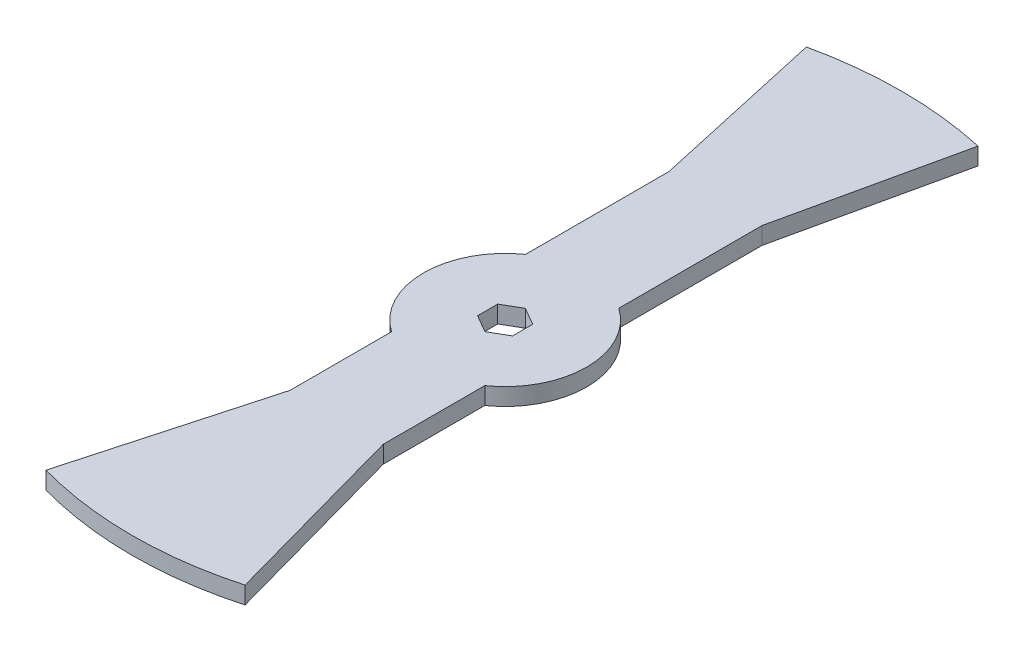
ISO-10303-21;
HEADER;
FILE_DESCRIPTION(('STEP AP214'),'2;1');
FILE_NAME('part.step','',(''),(''),'','','');
FILE_SCHEMA(('AUTOMOTIVE_DESIGN { 1 0 10303 214 1 1 1 1 }'));
ENDSEC;
DATA;
#1=APPLICATION_CONTEXT('core data for automotive mechanical design processes');
#2=APPLICATION_PROTOCOL_DEFINITION('international standard','automotive_design',2000,#1);
#3=PRODUCT_CONTEXT('',#1,'mechanical');
#4=PRODUCT('Part','Part','',(#3));
#5=PRODUCT_RELATED_PRODUCT_CATEGORY('part','',(#4));
#6=PRODUCT_DEFINITION_FORMATION('','',#4);
#7=PRODUCT_DEFINITION_CONTEXT('part definition',#1,'design');
#8=PRODUCT_DEFINITION('design','',#6,#7);
#9=PRODUCT_DEFINITION_SHAPE('','',#8);
#10=(LENGTH_UNIT() NAMED_UNIT(*) SI_UNIT(.MILLI.,.METRE.));
#11=(NAMED_UNIT(*) PLANE_ANGLE_UNIT() SI_UNIT($,.RADIAN.));
#12=(NAMED_UNIT(*) SI_UNIT($,.STERADIAN.) SOLID_ANGLE_UNIT());
#13=UNCERTAINTY_MEASURE_WITH_UNIT(LENGTH_MEASURE(1.E-05),#10,'distance_accuracy_value','');
#14=(GEOMETRIC_REPRESENTATION_CONTEXT(3) GLOBAL_UNCERTAINTY_ASSIGNED_CONTEXT((#13)) GLOBAL_UNIT_ASSIGNED_CONTEXT((#10,
#11,#12)) REPRESENTATION_CONTEXT('',''));
#15=CARTESIAN_POINT('',(0.,0.,0.));
#16=DIRECTION('',(0.,0.,1.));
#17=DIRECTION('',(1.,0.,0.));
#18=AXIS2_PLACEMENT_3D('',#15,#16,#17);
#19=CARTESIAN_POINT('',(-12.7,2.3495,-57.2859979965079));
#20=DIRECTION('',(1.,0.,0.));
#21=DIRECTION('',(0.,0.,-1.));
#22=AXIS2_PLACEMENT_3D('',#19,#20,#21);
#23=PLANE('',#22);
#24=DIRECTION('',(0.,0.,1.));
#25=VECTOR('',#24,1.);
#26=CARTESIAN_POINT('',(-12.7,2.3495,-57.2859979965079));
#27=LINE('',#26,#25);
#28=CARTESIAN_POINT('',(-12.7,2.3495,18.2389864027582));
#29=VERTEX_POINT('',#28);
#30=CARTESIAN_POINT('',(-12.7,2.3495,45.8886315989288));
#31=VERTEX_POINT('',#30);
#32=EDGE_CURVE('E180',#29,#31,#27,.T.);
#33=ORIENTED_EDGE('',*,*,#32,.F.);
#34=DIRECTION('',(0.,-1.,0.));
#35=VECTOR('',#34,1.);
#36=CARTESIAN_POINT('',(-12.7,65.2112928474841,18.2389864027582));
#37=LINE('',#36,#35);
#38=CARTESIAN_POINT('',(-12.7,-2.3495,18.2389864027582));
#39=VERTEX_POINT('',#38);
#40=EDGE_CURVE('E160',#29,#39,#37,.T.);
#41=ORIENTED_EDGE('',*,*,#40,.T.);
#42=DIRECTION('',(0.,0.,1.));
#43=VECTOR('',#42,1.);
#44=CARTESIAN_POINT('',(-12.7,-2.3495,-57.2859979965079));
#45=LINE('',#44,#43);
#46=CARTESIAN_POINT('',(-12.7,-2.3495,45.8886315989288));
#47=VERTEX_POINT('',#46);
#48=EDGE_CURVE('E202',#39,#47,#45,.T.);
#49=ORIENTED_EDGE('',*,*,#48,.T.);
#50=DIRECTION('',(0.,-1.,0.));
#51=VECTOR('',#50,1.);
#52=CARTESIAN_POINT('',(-12.7,2.3495,45.8886315989288));
#53=LINE('',#52,#51);
#54=EDGE_CURVE('E231',#31,#47,#53,.T.);
#55=ORIENTED_EDGE('',*,*,#54,.F.);
#56=EDGE_LOOP('',(#33,#41,#49,#55));
#57=FACE_BOUND('',#56,.T.);
#58=ADVANCED_FACE('F33',(#57),#23,.F.);
#59=CARTESIAN_POINT('',(12.7,2.3495,-57.2859979965078));
#60=DIRECTION('',(-1.,0.,0.));
#61=DIRECTION('',(0.,0.,1.));
#62=AXIS2_PLACEMENT_3D('',#59,#60,#61);
#63=PLANE('',#62);
#64=DIRECTION('',(0.,0.,-1.));
#65=VECTOR('',#64,1.);
#66=CARTESIAN_POINT('',(12.7,2.3495,-57.2859979965078));
#67=LINE('',#66,#65);
#68=CARTESIAN_POINT('',(12.7,2.3495,-18.2389864027582));
#69=VERTEX_POINT('',#68);
#70=CARTESIAN_POINT('',(12.7,2.3495,-57.2859979965078));
#71=VERTEX_POINT('',#70);
#72=EDGE_CURVE('E190',#69,#71,#67,.T.);
#73=ORIENTED_EDGE('',*,*,#72,.F.);
#74=DIRECTION('',(0.,-1.,0.));
#75=VECTOR('',#74,1.);
#76=CARTESIAN_POINT('',(12.7,65.2112928474841,-18.2389864027582));
#77=LINE('',#76,#75);
#78=CARTESIAN_POINT('',(12.7,-2.3495,-18.2389864027582));
#79=VERTEX_POINT('',#78);
#80=EDGE_CURVE('E172',#69,#79,#77,.T.);
#81=ORIENTED_EDGE('',*,*,#80,.T.);
#82=DIRECTION('',(0.,0.,-1.));
#83=VECTOR('',#82,1.);
#84=CARTESIAN_POINT('',(12.7,-2.3495,-57.2859979965078));
#85=LINE('',#84,#83);
#86=CARTESIAN_POINT('',(12.7,-2.3495,-57.2859979965078));
#87=VERTEX_POINT('',#86);
#88=EDGE_CURVE('E210',#79,#87,#85,.T.);
#89=ORIENTED_EDGE('',*,*,#88,.T.);
#90=DIRECTION('',(0.,-1.,0.));
#91=VECTOR('',#90,1.);
#92=CARTESIAN_POINT('',(12.7,2.3495,-57.2859979965078));
#93=LINE('',#92,#91);
#94=EDGE_CURVE('E219',#71,#87,#93,.T.);
#95=ORIENTED_EDGE('',*,*,#94,.F.);
#96=EDGE_LOOP('',(#73,#81,#89,#95));
#97=FACE_BOUND('',#96,.T.);
#98=ADVANCED_FACE('F310',(#97),#63,.F.);
#99=CARTESIAN_POINT('',(0.,2.3495,0.));
#100=DIRECTION('',(0.,-1.,0.));
#101=DIRECTION('',(0.,0.,-1.));
#102=AXIS2_PLACEMENT_3D('',#99,#100,#101);
#103=CYLINDRICAL_SURFACE('',#102,107.95);
#104=CARTESIAN_POINT('',(0.,-2.3495,0.));
#105=DIRECTION('',(0.,1.,0.));
#106=DIRECTION('',(0.,0.,-1.));
#107=AXIS2_PLACEMENT_3D('',#104,#105,#106);
#108=CIRCLE('',#107,107.95);
#109=CARTESIAN_POINT('',(23.3646563246183,-2.3495,-105.391153968597));
#110=VERTEX_POINT('',#109);
#111=CARTESIAN_POINT('',(-23.3646563246183,-2.3495,-105.391153968597));
#112=VERTEX_POINT('',#111);
#113=EDGE_CURVE('E196',#110,#112,#108,.T.);
#114=ORIENTED_EDGE('',*,*,#113,.T.);
#115=DIRECTION('',(0.,-1.,0.));
#116=VECTOR('',#115,1.);
#117=CARTESIAN_POINT('',(-23.3646563246183,2.3495,-105.391153968597));
#118=LINE('',#117,#116);
#119=CARTESIAN_POINT('',(-23.3646563246183,2.3495,-105.391153968597));
#120=VERTEX_POINT('',#119);
#121=EDGE_CURVE('E11',#120,#112,#118,.T.);
#122=ORIENTED_EDGE('',*,*,#121,.F.);
#123=CARTESIAN_POINT('',(0.,2.3495,0.));
#124=DIRECTION('',(0.,1.,0.));
#125=DIRECTION('',(0.,0.,-1.));
#126=AXIS2_PLACEMENT_3D('',#123,#124,#125);
#127=CIRCLE('',#126,107.95);
#128=CARTESIAN_POINT('',(23.3646563246183,2.3495,-105.391153968597));
#129=VERTEX_POINT('',#128);
#130=EDGE_CURVE('E216',#129,#120,#127,.T.);
#131=ORIENTED_EDGE('',*,*,#130,.F.);
#132=DIRECTION('',(0.,-1.,0.));
#133=VECTOR('',#132,1.);
#134=CARTESIAN_POINT('',(23.3646563246183,2.3495,-105.391153968597));
#135=LINE('',#134,#133);
#136=EDGE_CURVE('E195',#129,#110,#135,.T.);
#137=ORIENTED_EDGE('',*,*,#136,.T.);
#138=EDGE_LOOP('',(#114,#122,#131,#137));
#139=FACE_BOUND('',#138,.T.);
#140=ADVANCED_FACE('F35',(#139),#103,.T.);
#141=CARTESIAN_POINT('',(-23.3646563246183,2.3495,-105.391153968597));
#142=DIRECTION('',(0.976296007119933,0.,-0.216439613938104));
#143=DIRECTION('',(-0.216439613938104,0.,-0.976296007119933));
#144=AXIS2_PLACEMENT_3D('',#141,#142,#143);
#145=PLANE('',#144);
#146=DIRECTION('',(0.216439613938104,0.,0.976296007119933));
#147=VECTOR('',#146,1.);
#148=CARTESIAN_POINT('',(-23.3646563246183,-2.3495,-105.391153968597));
#149=LINE('',#148,#147);
#150=CARTESIAN_POINT('',(-12.7,-2.3495,-57.2859979965079));
#151=VERTEX_POINT('',#150);
#152=EDGE_CURVE('E199',#112,#151,#149,.T.);
#153=ORIENTED_EDGE('',*,*,#152,.T.);
#154=DIRECTION('',(0.,-1.,0.));
#155=VECTOR('',#154,1.);
#156=CARTESIAN_POINT('',(-12.7,2.3495,-57.2859979965079));
#157=LINE('',#156,#155);
#158=CARTESIAN_POINT('',(-12.7,2.3495,-57.2859979965079));
#159=VERTEX_POINT('',#158);
#160=EDGE_CURVE('E41',#159,#151,#157,.T.);
#161=ORIENTED_EDGE('',*,*,#160,.F.);
#162=DIRECTION('',(0.216439613938104,0.,0.976296007119933));
#163=VECTOR('',#162,1.);
#164=CARTESIAN_POINT('',(-23.3646563246183,2.3495,-105.391153968597));
#165=LINE('',#164,#163);
#166=EDGE_CURVE('E177',#120,#159,#165,.T.);
#167=ORIENTED_EDGE('',*,*,#166,.F.);
#168=ORIENTED_EDGE('',*,*,#121,.T.);
#169=EDGE_LOOP('',(#153,#161,#167,#168));
#170=FACE_BOUND('',#169,.T.);
#171=ADVANCED_FACE('F302',(#170),#145,.F.);
#172=CARTESIAN_POINT('',(-12.7,-2.3495,-18.2389864027582));
#173=VERTEX_POINT('',#172);
#174=EDGE_CURVE('E171',#151,#173,#45,.T.);
#175=ORIENTED_EDGE('',*,*,#174,.T.);
#176=DIRECTION('',(0.,-1.,0.));
#177=VECTOR('',#176,1.);
#178=CARTESIAN_POINT('',(-12.7,65.2112928474841,-18.2389864027582));
#179=LINE('',#178,#177);
#180=CARTESIAN_POINT('',(-12.7,2.3495,-18.2389864027582));
#181=VERTEX_POINT('',#180);
#182=EDGE_CURVE('E157',#173,#181,#179,.F.);
#183=ORIENTED_EDGE('',*,*,#182,.T.);
#184=EDGE_CURVE('E169',#159,#181,#27,.T.);
#185=ORIENTED_EDGE('',*,*,#184,.F.);
#186=ORIENTED_EDGE('',*,*,#160,.T.);
#187=EDGE_LOOP('',(#175,#183,#185,#186));
#188=FACE_BOUND('',#187,.T.);
#189=ADVANCED_FACE('F167',(#188),#23,.F.);
#190=CARTESIAN_POINT('',(-12.7,2.3495,45.8886315989288));
#191=DIRECTION('',(0.963771177867039,0.,0.266730419548991));
#192=DIRECTION('',(0.266730419548991,0.,-0.963771177867039));
#193=AXIS2_PLACEMENT_3D('',#190,#191,#192);
#194=PLANE('',#193);
#195=DIRECTION('',(-0.266730419548991,0.,0.963771177867039));
#196=VECTOR('',#195,1.);
#197=CARTESIAN_POINT('',(-12.7,-2.3495,45.8886315989288));
#198=LINE('',#197,#196);
#199=CARTESIAN_POINT('',(-27.0998106261775,-2.3495,97.9191516712911));
#200=VERTEX_POINT('',#199);
#201=EDGE_CURVE('E204',#47,#200,#198,.T.);
#202=ORIENTED_EDGE('',*,*,#201,.T.);
#203=DIRECTION('',(0.,-1.,0.));
#204=VECTOR('',#203,1.);
#205=CARTESIAN_POINT('',(-27.0998106261775,2.3495,97.9191516712911));
#206=LINE('',#205,#204);
#207=CARTESIAN_POINT('',(-27.0998106261775,2.3495,97.9191516712911));
#208=VERTEX_POINT('',#207);
#209=EDGE_CURVE('E228',#208,#200,#206,.T.);
#210=ORIENTED_EDGE('',*,*,#209,.F.);
#211=DIRECTION('',(-0.266730419548991,0.,0.963771177867039));
#212=VECTOR('',#211,1.);
#213=CARTESIAN_POINT('',(-12.7,2.3495,45.8886315989288));
#214=LINE('',#213,#212);
#215=EDGE_CURVE('E179',#31,#208,#214,.T.);
#216=ORIENTED_EDGE('',*,*,#215,.F.);
#217=ORIENTED_EDGE('',*,*,#54,.T.);
#218=EDGE_LOOP('',(#202,#210,#216,#217));
#219=FACE_BOUND('',#218,.T.);
#220=ADVANCED_FACE('F308',(#219),#194,.F.);
#221=CARTESIAN_POINT('',(0.,2.3495,0.));
#222=DIRECTION('',(0.,-1.,0.));
#223=DIRECTION('',(0.,0.,-1.));
#224=AXIS2_PLACEMENT_3D('',#221,#222,#223);
#225=CYLINDRICAL_SURFACE('',#224,101.6);
#226=CARTESIAN_POINT('',(0.,-2.3495,0.));
#227=DIRECTION('',(0.,1.,0.));
#228=DIRECTION('',(0.,0.,1.));
#229=AXIS2_PLACEMENT_3D('',#226,#227,#228);
#230=CIRCLE('',#229,101.6);
#231=CARTESIAN_POINT('',(27.0998106261776,-2.3495,97.9191516712911));
#232=VERTEX_POINT('',#231);
#233=EDGE_CURVE('E206',#200,#232,#230,.T.);
#234=ORIENTED_EDGE('',*,*,#233,.T.);
#235=DIRECTION('',(0.,-1.,0.));
#236=VECTOR('',#235,1.);
#237=CARTESIAN_POINT('',(27.0998106261776,2.3495,97.9191516712911));
#238=LINE('',#237,#236);
#239=CARTESIAN_POINT('',(27.0998106261776,2.3495,97.9191516712911));
#240=VERTEX_POINT('',#239);
#241=EDGE_CURVE('E225',#240,#232,#238,.T.);
#242=ORIENTED_EDGE('',*,*,#241,.F.);
#243=CARTESIAN_POINT('',(0.,2.3495,0.));
#244=DIRECTION('',(0.,1.,0.));
#245=DIRECTION('',(0.,0.,1.));
#246=AXIS2_PLACEMENT_3D('',#243,#244,#245);
#247=CIRCLE('',#246,101.6);
#248=EDGE_CURVE('E182',#208,#240,#247,.T.);
#249=ORIENTED_EDGE('',*,*,#248,.F.);
#250=ORIENTED_EDGE('',*,*,#209,.T.);
#251=EDGE_LOOP('',(#234,#242,#249,#250));
#252=FACE_BOUND('',#251,.T.);
#253=ADVANCED_FACE('F322',(#252),#225,.T.);
#254=CARTESIAN_POINT('',(12.7,2.3495,45.8886315989287));
#255=DIRECTION('',(-0.963771177867038,0.,0.266730419548992));
#256=DIRECTION('',(0.266730419548992,0.,0.963771177867039));
#257=AXIS2_PLACEMENT_3D('',#254,#255,#256);
#258=PLANE('',#257);
#259=DIRECTION('',(-0.266730419548992,0.,-0.963771177867039));
#260=VECTOR('',#259,1.);
#261=CARTESIAN_POINT('',(12.7,-2.3495,45.8886315989287));
#262=LINE('',#261,#260);
#263=CARTESIAN_POINT('',(12.7,-2.3495,45.8886315989287));
#264=VERTEX_POINT('',#263);
#265=EDGE_CURVE('E208',#232,#264,#262,.T.);
#266=ORIENTED_EDGE('',*,*,#265,.T.);
#267=DIRECTION('',(0.,-1.,0.));
#268=VECTOR('',#267,1.);
#269=CARTESIAN_POINT('',(12.7,2.3495,45.8886315989287));
#270=LINE('',#269,#268);
#271=CARTESIAN_POINT('',(12.7,2.3495,45.8886315989287));
#272=VERTEX_POINT('',#271);
#273=EDGE_CURVE('E222',#272,#264,#270,.T.);
#274=ORIENTED_EDGE('',*,*,#273,.F.);
#275=DIRECTION('',(-0.266730419548992,0.,-0.963771177867039));
#276=VECTOR('',#275,1.);
#277=CARTESIAN_POINT('',(12.7,2.3495,45.8886315989287));
#278=LINE('',#277,#276);
#279=EDGE_CURVE('E188',#240,#272,#278,.T.);
#280=ORIENTED_EDGE('',*,*,#279,.F.);
#281=ORIENTED_EDGE('',*,*,#241,.T.);
#282=EDGE_LOOP('',(#266,#274,#280,#281));
#283=FACE_BOUND('',#282,.T.);
#284=ADVANCED_FACE('F326',(#283),#258,.F.);
#285=CARTESIAN_POINT('',(12.7,-2.3495,18.2389864027582));
#286=VERTEX_POINT('',#285);
#287=EDGE_CURVE('E211',#264,#286,#85,.T.);
#288=ORIENTED_EDGE('',*,*,#287,.T.);
#289=DIRECTION('',(0.,-1.,0.));
#290=VECTOR('',#289,1.);
#291=CARTESIAN_POINT('',(12.7,65.2112928474841,18.2389864027582));
#292=LINE('',#291,#290);
#293=CARTESIAN_POINT('',(12.7,2.3495,18.2389864027582));
#294=VERTEX_POINT('',#293);
#295=EDGE_CURVE('E162',#286,#294,#292,.F.);
#296=ORIENTED_EDGE('',*,*,#295,.T.);
#297=EDGE_CURVE('E191',#272,#294,#67,.T.);
#298=ORIENTED_EDGE('',*,*,#297,.F.);
#299=ORIENTED_EDGE('',*,*,#273,.T.);
#300=EDGE_LOOP('',(#288,#296,#298,#299));
#301=FACE_BOUND('',#300,.T.);
#302=ADVANCED_FACE('F318',(#301),#63,.F.);
#303=CARTESIAN_POINT('',(12.7,2.3495,-57.2859979965078));
#304=DIRECTION('',(-0.976296007119933,0.,-0.216439613938103));
#305=DIRECTION('',(-0.216439613938103,0.,0.976296007119933));
#306=AXIS2_PLACEMENT_3D('',#303,#304,#305);
#307=PLANE('',#306);
#308=DIRECTION('',(0.216439613938103,0.,-0.976296007119933));
#309=VECTOR('',#308,1.);
#310=CARTESIAN_POINT('',(12.7,-2.3495,-57.2859979965078));
#311=LINE('',#310,#309);
#312=EDGE_CURVE('E214',#87,#110,#311,.T.);
#313=ORIENTED_EDGE('',*,*,#312,.T.);
#314=ORIENTED_EDGE('',*,*,#136,.F.);
#315=DIRECTION('',(0.216439613938103,0.,-0.976296007119933));
#316=VECTOR('',#315,1.);
#317=CARTESIAN_POINT('',(12.7,2.3495,-57.2859979965078));
#318=LINE('',#317,#316);
#319=EDGE_CURVE('E193',#71,#129,#318,.T.);
#320=ORIENTED_EDGE('',*,*,#319,.F.);
#321=ORIENTED_EDGE('',*,*,#94,.T.);
#322=EDGE_LOOP('',(#313,#314,#320,#321));
#323=FACE_BOUND('',#322,.T.);
#324=ADVANCED_FACE('F332',(#323),#307,.F.);
#325=CARTESIAN_POINT('',(0.,2.3495,0.));
#326=DIRECTION('',(0.,-1.,0.));
#327=DIRECTION('',(0.,0.,-1.));
#328=AXIS2_PLACEMENT_3D('',#325,#326,#327);
#329=PLANE('',#328);
#330=ORIENTED_EDGE('',*,*,#184,.T.);
#331=CARTESIAN_POINT('',(0.,2.3495,0.));
#332=DIRECTION('',(0.,-1.,0.));
#333=DIRECTION('',(0.,0.,-1.));
#334=AXIS2_PLACEMENT_3D('',#331,#332,#333);
#335=CIRCLE('',#334,22.225);
#336=EDGE_CURVE('E55',#181,#29,#335,.F.);
#337=ORIENTED_EDGE('',*,*,#336,.T.);
#338=ORIENTED_EDGE('',*,*,#32,.T.);
#339=ORIENTED_EDGE('',*,*,#215,.T.);
#340=ORIENTED_EDGE('',*,*,#248,.T.);
#341=ORIENTED_EDGE('',*,*,#279,.T.);
#342=ORIENTED_EDGE('',*,*,#297,.T.);
#343=EDGE_CURVE('E48',#294,#69,#335,.F.);
#344=ORIENTED_EDGE('',*,*,#343,.T.);
#345=ORIENTED_EDGE('',*,*,#72,.T.);
#346=ORIENTED_EDGE('',*,*,#319,.T.);
#347=ORIENTED_EDGE('',*,*,#130,.T.);
#348=ORIENTED_EDGE('',*,*,#166,.T.);
#349=EDGE_LOOP('',(#330,#337,#338,#339,#340,#341,#342,#344,#345,#346,#347,#348));
#350=FACE_BOUND('',#349,.T.);
#351=DIRECTION('',(0.,0.,-1.));
#352=VECTOR('',#351,1.);
#353=CARTESIAN_POINT('',(4.7625,2.3495,2.74963065701559));
#354=LINE('',#353,#352);
#355=CARTESIAN_POINT('',(4.7625,2.3495,2.74963065701559));
#356=VERTEX_POINT('',#355);
#357=CARTESIAN_POINT('',(4.7625,2.3495,-2.7496306570156));
#358=VERTEX_POINT('',#357);
#359=EDGE_CURVE('E268',#356,#358,#354,.T.);
#360=ORIENTED_EDGE('',*,*,#359,.F.);
#361=DIRECTION('',(0.866025403784439,0.,-0.5));
#362=VECTOR('',#361,1.);
#363=CARTESIAN_POINT('',(0.,2.3495,5.49926131403119));
#364=LINE('',#363,#362);
#365=CARTESIAN_POINT('',(0.,2.3495,5.49926131403119));
#366=VERTEX_POINT('',#365);
#367=EDGE_CURVE('E266',#366,#356,#364,.T.);
#368=ORIENTED_EDGE('',*,*,#367,.F.);
#369=DIRECTION('',(0.866025403784439,0.,0.5));
#370=VECTOR('',#369,1.);
#371=CARTESIAN_POINT('',(-4.7625,2.3495,2.74963065701559));
#372=LINE('',#371,#370);
#373=CARTESIAN_POINT('',(-4.7625,2.3495,2.74963065701559));
#374=VERTEX_POINT('',#373);
#375=EDGE_CURVE('E280',#374,#366,#372,.T.);
#376=ORIENTED_EDGE('',*,*,#375,.F.);
#377=DIRECTION('',(0.,0.,1.));
#378=VECTOR('',#377,1.);
#379=CARTESIAN_POINT('',(-4.7625,2.3495,-2.7496306570156));
#380=LINE('',#379,#378);
#381=CARTESIAN_POINT('',(-4.7625,2.3495,-2.7496306570156));
#382=VERTEX_POINT('',#381);
#383=EDGE_CURVE('E277',#382,#374,#380,.T.);
#384=ORIENTED_EDGE('',*,*,#383,.F.);
#385=DIRECTION('',(-0.866025403784439,0.,0.5));
#386=VECTOR('',#385,1.);
#387=CARTESIAN_POINT('',(0.,2.3495,-5.49926131403119));
#388=LINE('',#387,#386);
#389=CARTESIAN_POINT('',(0.,2.3495,-5.49926131403119));
#390=VERTEX_POINT('',#389);
#391=EDGE_CURVE('E274',#390,#382,#388,.T.);
#392=ORIENTED_EDGE('',*,*,#391,.F.);
#393=DIRECTION('',(-0.866025403784439,0.,-0.5));
#394=VECTOR('',#393,1.);
#395=CARTESIAN_POINT('',(4.7625,2.3495,-2.7496306570156));
#396=LINE('',#395,#394);
#397=EDGE_CURVE('E271',#358,#390,#396,.T.);
#398=ORIENTED_EDGE('',*,*,#397,.F.);
#399=EDGE_LOOP('',(#360,#368,#376,#384,#392,#398));
#400=FACE_BOUND('',#399,.T.);
#401=ADVANCED_FACE('F174',(#350,#400),#329,.F.);
#402=CARTESIAN_POINT('',(0.,-2.3495,0.));
#403=DIRECTION('',(0.,-1.,0.));
#404=DIRECTION('',(0.,0.,-1.));
#405=AXIS2_PLACEMENT_3D('',#402,#403,#404);
#406=PLANE('',#405);
#407=ORIENTED_EDGE('',*,*,#88,.F.);
#408=CARTESIAN_POINT('',(0.,-2.3495,0.));
#409=DIRECTION('',(0.,-1.,0.));
#410=DIRECTION('',(0.,0.,-1.));
#411=AXIS2_PLACEMENT_3D('',#408,#409,#410);
#412=CIRCLE('',#411,22.225);
#413=EDGE_CURVE('E242',#79,#286,#412,.T.);
#414=ORIENTED_EDGE('',*,*,#413,.T.);
#415=ORIENTED_EDGE('',*,*,#287,.F.);
#416=ORIENTED_EDGE('',*,*,#265,.F.);
#417=ORIENTED_EDGE('',*,*,#233,.F.);
#418=ORIENTED_EDGE('',*,*,#201,.F.);
#419=ORIENTED_EDGE('',*,*,#48,.F.);
#420=EDGE_CURVE('E240',#39,#173,#412,.T.);
#421=ORIENTED_EDGE('',*,*,#420,.T.);
#422=ORIENTED_EDGE('',*,*,#174,.F.);
#423=ORIENTED_EDGE('',*,*,#152,.F.);
#424=ORIENTED_EDGE('',*,*,#113,.F.);
#425=ORIENTED_EDGE('',*,*,#312,.F.);
#426=EDGE_LOOP('',(#407,#414,#415,#416,#417,#418,#419,#421,#422,#423,#424,#425));
#427=FACE_BOUND('',#426,.T.);
#428=DIRECTION('',(0.866025403784439,0.,-0.5));
#429=VECTOR('',#428,1.);
#430=CARTESIAN_POINT('',(0.,-2.3495,5.49926131403119));
#431=LINE('',#430,#429);
#432=CARTESIAN_POINT('',(0.,-2.3495,5.49926131403119));
#433=VERTEX_POINT('',#432);
#434=CARTESIAN_POINT('',(4.7625,-2.3495,2.74963065701559));
#435=VERTEX_POINT('',#434);
#436=EDGE_CURVE('E263',#433,#435,#431,.T.);
#437=ORIENTED_EDGE('',*,*,#436,.T.);
#438=DIRECTION('',(0.,0.,-1.));
#439=VECTOR('',#438,1.);
#440=CARTESIAN_POINT('',(4.7625,-2.3495,2.74963065701559));
#441=LINE('',#440,#439);
#442=CARTESIAN_POINT('',(4.7625,-2.3495,-2.7496306570156));
#443=VERTEX_POINT('',#442);
#444=EDGE_CURVE('E200',#435,#443,#441,.T.);
#445=ORIENTED_EDGE('',*,*,#444,.T.);
#446=DIRECTION('',(-0.866025403784439,0.,-0.5));
#447=VECTOR('',#446,1.);
#448=CARTESIAN_POINT('',(4.7625,-2.3495,-2.7496306570156));
#449=LINE('',#448,#447);
#450=CARTESIAN_POINT('',(0.,-2.3495,-5.49926131403119));
#451=VERTEX_POINT('',#450);
#452=EDGE_CURVE('E251',#443,#451,#449,.T.);
#453=ORIENTED_EDGE('',*,*,#452,.T.);
#454=DIRECTION('',(-0.866025403784439,0.,0.5));
#455=VECTOR('',#454,1.);
#456=CARTESIAN_POINT('',(0.,-2.3495,-5.49926131403119));
#457=LINE('',#456,#455);
#458=CARTESIAN_POINT('',(-4.7625,-2.3495,-2.7496306570156));
#459=VERTEX_POINT('',#458);
#460=EDGE_CURVE('E254',#451,#459,#457,.T.);
#461=ORIENTED_EDGE('',*,*,#460,.T.);
#462=DIRECTION('',(0.,0.,1.));
#463=VECTOR('',#462,1.);
#464=CARTESIAN_POINT('',(-4.7625,-2.3495,-2.7496306570156));
#465=LINE('',#464,#463);
#466=CARTESIAN_POINT('',(-4.7625,-2.3495,2.74963065701559));
#467=VERTEX_POINT('',#466);
#468=EDGE_CURVE('E257',#459,#467,#465,.T.);
#469=ORIENTED_EDGE('',*,*,#468,.T.);
#470=DIRECTION('',(0.866025403784439,0.,0.5));
#471=VECTOR('',#470,1.);
#472=CARTESIAN_POINT('',(-4.7625,-2.3495,2.74963065701559));
#473=LINE('',#472,#471);
#474=EDGE_CURVE('E260',#467,#433,#473,.T.);
#475=ORIENTED_EDGE('',*,*,#474,.T.);
#476=EDGE_LOOP('',(#437,#445,#453,#461,#469,#475));
#477=FACE_BOUND('',#476,.T.);
#478=ADVANCED_FACE('F236',(#427,#477),#406,.T.);
#479=CARTESIAN_POINT('',(0.,-2.3505,5.49926131403119));
#480=DIRECTION('',(0.5,0.,0.866025403784439));
#481=DIRECTION('',(0.866025403784439,0.,-0.5));
#482=AXIS2_PLACEMENT_3D('',#479,#480,#481);
#483=PLANE('',#482);
#484=DIRECTION('',(0.,1.,0.));
#485=VECTOR('',#484,1.);
#486=CARTESIAN_POINT('',(0.,-2.3505,5.49926131403119));
#487=LINE('',#486,#485);
#488=EDGE_CURVE('E284',#433,#366,#487,.T.);
#489=ORIENTED_EDGE('',*,*,#488,.T.);
#490=ORIENTED_EDGE('',*,*,#367,.T.);
#491=DIRECTION('',(0.,1.,0.));
#492=VECTOR('',#491,1.);
#493=CARTESIAN_POINT('',(4.7625,-2.3505,2.74963065701559));
#494=LINE('',#493,#492);
#495=EDGE_CURVE('E283',#435,#356,#494,.T.);
#496=ORIENTED_EDGE('',*,*,#495,.F.);
#497=ORIENTED_EDGE('',*,*,#436,.F.);
#498=EDGE_LOOP('',(#489,#490,#496,#497));
#499=FACE_BOUND('',#498,.T.);
#500=ADVANCED_FACE('F339',(#499),#483,.F.);
#501=CARTESIAN_POINT('',(-4.7625,-2.3505,2.74963065701559));
#502=DIRECTION('',(-0.5,0.,0.866025403784439));
#503=DIRECTION('',(0.866025403784439,0.,0.5));
#504=AXIS2_PLACEMENT_3D('',#501,#502,#503);
#505=PLANE('',#504);
#506=DIRECTION('',(0.,1.,0.));
#507=VECTOR('',#506,1.);
#508=CARTESIAN_POINT('',(-4.7625,-2.3505,2.74963065701559));
#509=LINE('',#508,#507);
#510=EDGE_CURVE('E286',#467,#374,#509,.T.);
#511=ORIENTED_EDGE('',*,*,#510,.T.);
#512=ORIENTED_EDGE('',*,*,#375,.T.);
#513=ORIENTED_EDGE('',*,*,#488,.F.);
#514=ORIENTED_EDGE('',*,*,#474,.F.);
#515=EDGE_LOOP('',(#511,#512,#513,#514));
#516=FACE_BOUND('',#515,.T.);
#517=ADVANCED_FACE('F344',(#516),#505,.F.);
#518=CARTESIAN_POINT('',(-4.7625,-2.3505,-2.7496306570156));
#519=DIRECTION('',(-1.,0.,0.));
#520=DIRECTION('',(0.,0.,1.));
#521=AXIS2_PLACEMENT_3D('',#518,#519,#520);
#522=PLANE('',#521);
#523=DIRECTION('',(0.,1.,0.));
#524=VECTOR('',#523,1.);
#525=CARTESIAN_POINT('',(-4.7625,-2.3505,-2.7496306570156));
#526=LINE('',#525,#524);
#527=EDGE_CURVE('E288',#459,#382,#526,.T.);
#528=ORIENTED_EDGE('',*,*,#527,.T.);
#529=ORIENTED_EDGE('',*,*,#383,.T.);
#530=ORIENTED_EDGE('',*,*,#510,.F.);
#531=ORIENTED_EDGE('',*,*,#468,.F.);
#532=EDGE_LOOP('',(#528,#529,#530,#531));
#533=FACE_BOUND('',#532,.T.);
#534=ADVANCED_FACE('F358',(#533),#522,.F.);
#535=CARTESIAN_POINT('',(0.,-2.3505,-5.49926131403119));
#536=DIRECTION('',(-0.5,0.,-0.866025403784439));
#537=DIRECTION('',(-0.866025403784439,0.,0.5));
#538=AXIS2_PLACEMENT_3D('',#535,#536,#537);
#539=PLANE('',#538);
#540=DIRECTION('',(0.,1.,0.));
#541=VECTOR('',#540,1.);
#542=CARTESIAN_POINT('',(0.,-2.3505,-5.49926131403119));
#543=LINE('',#542,#541);
#544=EDGE_CURVE('E290',#451,#390,#543,.T.);
#545=ORIENTED_EDGE('',*,*,#544,.T.);
#546=ORIENTED_EDGE('',*,*,#391,.T.);
#547=ORIENTED_EDGE('',*,*,#527,.F.);
#548=ORIENTED_EDGE('',*,*,#460,.F.);
#549=EDGE_LOOP('',(#545,#546,#547,#548));
#550=FACE_BOUND('',#549,.T.);
#551=ADVANCED_FACE('F354',(#550),#539,.F.);
#552=CARTESIAN_POINT('',(4.7625,-2.3505,-2.7496306570156));
#553=DIRECTION('',(0.5,0.,-0.866025403784439));
#554=DIRECTION('',(-0.866025403784439,0.,-0.5));
#555=AXIS2_PLACEMENT_3D('',#552,#553,#554);
#556=PLANE('',#555);
#557=DIRECTION('',(0.,1.,0.));
#558=VECTOR('',#557,1.);
#559=CARTESIAN_POINT('',(4.7625,-2.3505,-2.7496306570156));
#560=LINE('',#559,#558);
#561=EDGE_CURVE('E292',#443,#358,#560,.T.);
#562=ORIENTED_EDGE('',*,*,#561,.T.);
#563=ORIENTED_EDGE('',*,*,#397,.T.);
#564=ORIENTED_EDGE('',*,*,#544,.F.);
#565=ORIENTED_EDGE('',*,*,#452,.F.);
#566=EDGE_LOOP('',(#562,#563,#564,#565));
#567=FACE_BOUND('',#566,.T.);
#568=ADVANCED_FACE('F350',(#567),#556,.F.);
#569=CARTESIAN_POINT('',(4.7625,-2.3505,2.74963065701559));
#570=DIRECTION('',(1.,0.,0.));
#571=DIRECTION('',(0.,0.,-1.));
#572=AXIS2_PLACEMENT_3D('',#569,#570,#571);
#573=PLANE('',#572);
#574=ORIENTED_EDGE('',*,*,#495,.T.);
#575=ORIENTED_EDGE('',*,*,#359,.T.);
#576=ORIENTED_EDGE('',*,*,#561,.F.);
#577=ORIENTED_EDGE('',*,*,#444,.F.);
#578=EDGE_LOOP('',(#574,#575,#576,#577));
#579=FACE_BOUND('',#578,.T.);
#580=ADVANCED_FACE('F346',(#579),#573,.F.);
#581=CARTESIAN_POINT('',(0.,65.2112928474841,0.));
#582=DIRECTION('',(0.,-1.,0.));
#583=DIRECTION('',(0.,0.,-1.));
#584=AXIS2_PLACEMENT_3D('',#581,#582,#583);
#585=CYLINDRICAL_SURFACE('',#584,22.225);
#586=ORIENTED_EDGE('',*,*,#80,.F.);
#587=ORIENTED_EDGE('',*,*,#343,.F.);
#588=ORIENTED_EDGE('',*,*,#295,.F.);
#589=ORIENTED_EDGE('',*,*,#413,.F.);
#590=EDGE_LOOP('',(#586,#587,#588,#589));
#591=FACE_BOUND('',#590,.T.);
#592=ADVANCED_FACE('F349',(#591),#585,.T.);
#593=ORIENTED_EDGE('',*,*,#40,.F.);
#594=ORIENTED_EDGE('',*,*,#336,.F.);
#595=ORIENTED_EDGE('',*,*,#182,.F.);
#596=ORIENTED_EDGE('',*,*,#420,.F.);
#597=EDGE_LOOP('',(#593,#594,#595,#596));
#598=FACE_BOUND('',#597,.T.);
#599=ADVANCED_FACE('F156',(#598),#585,.T.);
#600=CLOSED_SHELL('',(#58,#98,#140,#171,#189,#220,#253,#284,#302,#324,#401,#478,#500,#517,#534,
#551,#568,#580,#592,#599));
#601=MANIFOLD_SOLID_BREP('B2',#600);
#602=ADVANCED_BREP_SHAPE_REPRESENTATION('',(#18,#601),#14);
#603=SHAPE_DEFINITION_REPRESENTATION(#9,#602);
ENDSEC;
END-ISO-10303-21;
